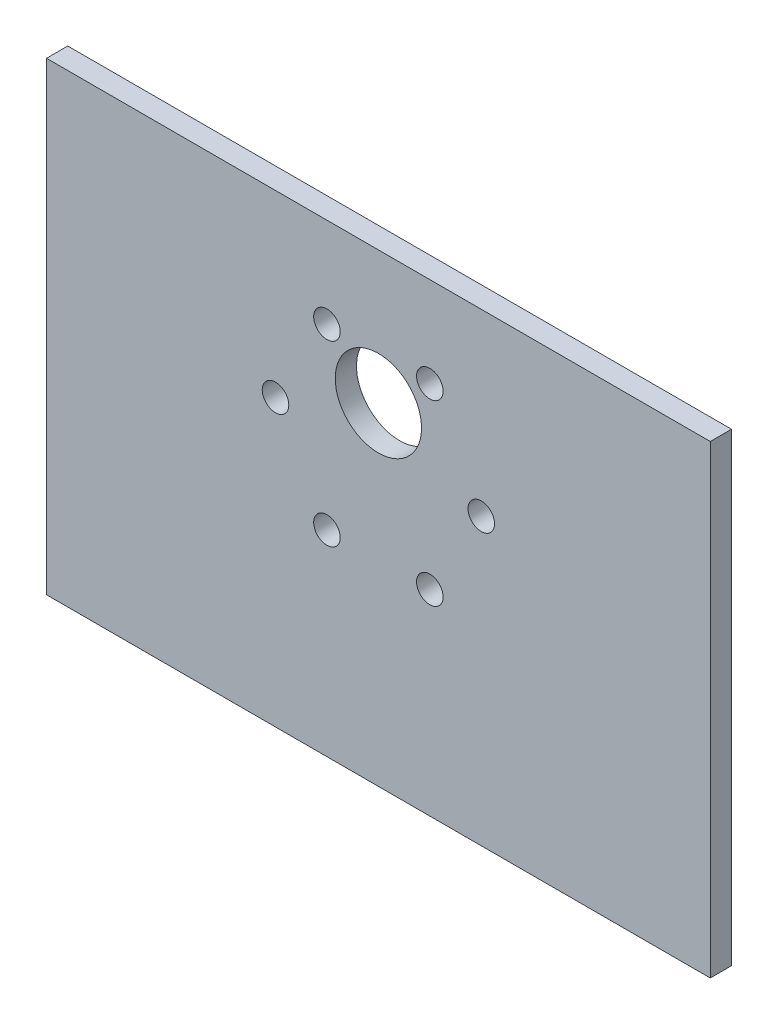
ISO-10303-21;
HEADER;
FILE_DESCRIPTION(('STEP AP214'),'2;1');
FILE_NAME('part.step','',(''),(''),'','','');
FILE_SCHEMA(('AUTOMOTIVE_DESIGN { 1 0 10303 214 1 1 1 1 }'));
ENDSEC;
DATA;
#1=APPLICATION_CONTEXT('core data for automotive mechanical design processes');
#2=APPLICATION_PROTOCOL_DEFINITION('international standard','automotive_design',2000,#1);
#3=PRODUCT_CONTEXT('',#1,'mechanical');
#4=PRODUCT('Part','Part','',(#3));
#5=PRODUCT_RELATED_PRODUCT_CATEGORY('part','',(#4));
#6=PRODUCT_DEFINITION_FORMATION('','',#4);
#7=PRODUCT_DEFINITION_CONTEXT('part definition',#1,'design');
#8=PRODUCT_DEFINITION('design','',#6,#7);
#9=PRODUCT_DEFINITION_SHAPE('','',#8);
#10=(LENGTH_UNIT() NAMED_UNIT(*) SI_UNIT(.MILLI.,.METRE.));
#11=(NAMED_UNIT(*) PLANE_ANGLE_UNIT() SI_UNIT($,.RADIAN.));
#12=(NAMED_UNIT(*) SI_UNIT($,.STERADIAN.) SOLID_ANGLE_UNIT());
#13=UNCERTAINTY_MEASURE_WITH_UNIT(LENGTH_MEASURE(1.E-05),#10,'distance_accuracy_value','');
#14=(GEOMETRIC_REPRESENTATION_CONTEXT(3) GLOBAL_UNCERTAINTY_ASSIGNED_CONTEXT((#13)) GLOBAL_UNIT_ASSIGNED_CONTEXT((#10,
#11,#12)) REPRESENTATION_CONTEXT('',''));
#15=CARTESIAN_POINT('',(0.,0.,0.));
#16=DIRECTION('',(0.,0.,1.));
#17=DIRECTION('',(1.,0.,0.));
#18=AXIS2_PLACEMENT_3D('',#15,#16,#17);
#19=CARTESIAN_POINT('',(0.,0.,3.2));
#20=DIRECTION('',(0.,0.,1.));
#21=DIRECTION('',(1.,0.,0.));
#22=AXIS2_PLACEMENT_3D('',#19,#20,#21);
#23=PLANE('',#22);
#24=CARTESIAN_POINT('',(7.75000000000024,13.4233937586586,3.2));
#25=DIRECTION('',(0.,0.,1.));
#26=DIRECTION('',(1.,0.,0.));
#27=AXIS2_PLACEMENT_3D('',#24,#25,#26);
#28=CIRCLE('',#27,2.);
#29=CARTESIAN_POINT('',(9.75000000000024,13.4233937586586,3.2));
#30=VERTEX_POINT('',#29);
#31=EDGE_CURVE('E147',#30,#30,#28,.T.);
#32=ORIENTED_EDGE('',*,*,#31,.F.);
#33=EDGE_LOOP('',(#32));
#34=FACE_BOUND('',#33,.T.);
#35=CARTESIAN_POINT('',(-15.5,2.17707796235089E-13,3.2));
#36=DIRECTION('',(0.,0.,1.));
#37=DIRECTION('',(1.,0.,0.));
#38=AXIS2_PLACEMENT_3D('',#35,#36,#37);
#39=CIRCLE('',#38,2.);
#40=CARTESIAN_POINT('',(-13.5,2.17707796235089E-13,3.2));
#41=VERTEX_POINT('',#40);
#42=EDGE_CURVE('E135',#41,#41,#39,.T.);
#43=ORIENTED_EDGE('',*,*,#42,.F.);
#44=EDGE_LOOP('',(#43));
#45=FACE_BOUND('',#44,.T.);
#46=CARTESIAN_POINT('',(0.,6.99999999999996,3.2));
#47=DIRECTION('',(0.,0.,1.));
#48=DIRECTION('',(1.,0.,0.));
#49=AXIS2_PLACEMENT_3D('',#46,#47,#48);
#50=CIRCLE('',#49,6.5);
#51=CARTESIAN_POINT('',(6.5,6.99999999999996,3.2));
#52=VERTEX_POINT('',#51);
#53=EDGE_CURVE('E123',#52,#52,#50,.T.);
#54=ORIENTED_EDGE('',*,*,#53,.F.);
#55=EDGE_LOOP('',(#54));
#56=FACE_BOUND('',#55,.T.);
#57=DIRECTION('',(0.,-1.,0.));
#58=VECTOR('',#57,1.);
#59=CARTESIAN_POINT('',(-50.,27.,3.2));
#60=LINE('',#59,#58);
#61=CARTESIAN_POINT('',(-50.,27.,3.2));
#62=VERTEX_POINT('',#61);
#63=CARTESIAN_POINT('',(-50.,-43.,3.2));
#64=VERTEX_POINT('',#63);
#65=EDGE_CURVE('E93',#62,#64,#60,.T.);
#66=ORIENTED_EDGE('',*,*,#65,.T.);
#67=DIRECTION('',(1.,0.,0.));
#68=VECTOR('',#67,1.);
#69=CARTESIAN_POINT('',(-50.,-43.,3.2));
#70=LINE('',#69,#68);
#71=CARTESIAN_POINT('',(50.,-43.,3.2));
#72=VERTEX_POINT('',#71);
#73=EDGE_CURVE('E88',#64,#72,#70,.T.);
#74=ORIENTED_EDGE('',*,*,#73,.T.);
#75=DIRECTION('',(0.,1.,0.));
#76=VECTOR('',#75,1.);
#77=CARTESIAN_POINT('',(50.,27.,3.2));
#78=LINE('',#77,#76);
#79=CARTESIAN_POINT('',(50.,27.,3.2));
#80=VERTEX_POINT('',#79);
#81=EDGE_CURVE('E91',#72,#80,#78,.T.);
#82=ORIENTED_EDGE('',*,*,#81,.T.);
#83=DIRECTION('',(-1.,0.,0.));
#84=VECTOR('',#83,1.);
#85=CARTESIAN_POINT('',(-50.,27.,3.2));
#86=LINE('',#85,#84);
#87=EDGE_CURVE('E58',#80,#62,#86,.T.);
#88=ORIENTED_EDGE('',*,*,#87,.T.);
#89=EDGE_LOOP('',(#66,#74,#82,#88));
#90=FACE_BOUND('',#89,.T.);
#91=CARTESIAN_POINT('',(7.74999999999987,-13.4233937586589,3.2));
#92=DIRECTION('',(0.,0.,1.));
#93=DIRECTION('',(1.,0.,0.));
#94=AXIS2_PLACEMENT_3D('',#91,#92,#93);
#95=CIRCLE('',#94,2.);
#96=CARTESIAN_POINT('',(9.74999999999987,-13.4233937586589,3.2));
#97=VERTEX_POINT('',#96);
#98=EDGE_CURVE('E108',#97,#97,#95,.T.);
#99=ORIENTED_EDGE('',*,*,#98,.F.);
#100=EDGE_LOOP('',(#99));
#101=FACE_BOUND('',#100,.T.);
#102=CARTESIAN_POINT('',(-7.75000000000015,-13.4233937586587,3.2));
#103=DIRECTION('',(0.,0.,1.));
#104=DIRECTION('',(1.,0.,0.));
#105=AXIS2_PLACEMENT_3D('',#102,#103,#104);
#106=CIRCLE('',#105,2.);
#107=CARTESIAN_POINT('',(-5.75000000000015,-13.4233937586587,3.2));
#108=VERTEX_POINT('',#107);
#109=EDGE_CURVE('E129',#108,#108,#106,.T.);
#110=ORIENTED_EDGE('',*,*,#109,.F.);
#111=EDGE_LOOP('',(#110));
#112=FACE_BOUND('',#111,.T.);
#113=CARTESIAN_POINT('',(-7.74999999999978,13.4233937586589,3.2));
#114=DIRECTION('',(0.,0.,1.));
#115=DIRECTION('',(1.,0.,0.));
#116=AXIS2_PLACEMENT_3D('',#113,#114,#115);
#117=CIRCLE('',#116,2.);
#118=CARTESIAN_POINT('',(-5.74999999999978,13.4233937586589,3.2));
#119=VERTEX_POINT('',#118);
#120=EDGE_CURVE('E141',#119,#119,#117,.T.);
#121=ORIENTED_EDGE('',*,*,#120,.F.);
#122=EDGE_LOOP('',(#121));
#123=FACE_BOUND('',#122,.T.);
#124=CARTESIAN_POINT('',(15.5,-3.21791204793698E-13,3.2));
#125=DIRECTION('',(0.,0.,1.));
#126=DIRECTION('',(1.,0.,0.));
#127=AXIS2_PLACEMENT_3D('',#124,#125,#126);
#128=CIRCLE('',#127,2.);
#129=CARTESIAN_POINT('',(17.5,-3.21791204793698E-13,3.2));
#130=VERTEX_POINT('',#129);
#131=EDGE_CURVE('E153',#130,#130,#128,.T.);
#132=ORIENTED_EDGE('',*,*,#131,.F.);
#133=EDGE_LOOP('',(#132));
#134=FACE_BOUND('',#133,.T.);
#135=ADVANCED_FACE('F41',(#34,#45,#56,#90,#101,#112,#123,#134),#23,.T.);
#136=CARTESIAN_POINT('',(0.,0.,0.));
#137=DIRECTION('',(0.,0.,1.));
#138=DIRECTION('',(1.,0.,0.));
#139=AXIS2_PLACEMENT_3D('',#136,#137,#138);
#140=PLANE('',#139);
#141=DIRECTION('',(0.,-1.,0.));
#142=VECTOR('',#141,1.);
#143=CARTESIAN_POINT('',(-50.,27.,0.));
#144=LINE('',#143,#142);
#145=CARTESIAN_POINT('',(-50.,27.,0.));
#146=VERTEX_POINT('',#145);
#147=CARTESIAN_POINT('',(-50.,-43.,0.));
#148=VERTEX_POINT('',#147);
#149=EDGE_CURVE('E105',#146,#148,#144,.T.);
#150=ORIENTED_EDGE('',*,*,#149,.F.);
#151=DIRECTION('',(-1.,0.,0.));
#152=VECTOR('',#151,1.);
#153=CARTESIAN_POINT('',(-50.,27.,0.));
#154=LINE('',#153,#152);
#155=CARTESIAN_POINT('',(50.,27.,0.));
#156=VERTEX_POINT('',#155);
#157=EDGE_CURVE('E81',#156,#146,#154,.T.);
#158=ORIENTED_EDGE('',*,*,#157,.F.);
#159=DIRECTION('',(0.,1.,0.));
#160=VECTOR('',#159,1.);
#161=CARTESIAN_POINT('',(50.,27.,0.));
#162=LINE('',#161,#160);
#163=CARTESIAN_POINT('',(50.,-43.,0.));
#164=VERTEX_POINT('',#163);
#165=EDGE_CURVE('E75',#164,#156,#162,.T.);
#166=ORIENTED_EDGE('',*,*,#165,.F.);
#167=DIRECTION('',(1.,0.,0.));
#168=VECTOR('',#167,1.);
#169=CARTESIAN_POINT('',(-50.,-43.,0.));
#170=LINE('',#169,#168);
#171=EDGE_CURVE('E97',#148,#164,#170,.T.);
#172=ORIENTED_EDGE('',*,*,#171,.F.);
#173=EDGE_LOOP('',(#150,#158,#166,#172));
#174=FACE_BOUND('',#173,.T.);
#175=CARTESIAN_POINT('',(7.74999999999987,-13.4233937586589,0.));
#176=DIRECTION('',(0.,0.,1.));
#177=DIRECTION('',(1.,0.,0.));
#178=AXIS2_PLACEMENT_3D('',#175,#176,#177);
#179=CIRCLE('',#178,2.);
#180=CARTESIAN_POINT('',(9.74999999999987,-13.4233937586589,0.));
#181=VERTEX_POINT('',#180);
#182=EDGE_CURVE('E120',#181,#181,#179,.T.);
#183=ORIENTED_EDGE('',*,*,#182,.T.);
#184=EDGE_LOOP('',(#183));
#185=FACE_BOUND('',#184,.T.);
#186=CARTESIAN_POINT('',(0.,6.99999999999996,0.));
#187=DIRECTION('',(0.,0.,1.));
#188=DIRECTION('',(1.,0.,0.));
#189=AXIS2_PLACEMENT_3D('',#186,#187,#188);
#190=CIRCLE('',#189,6.5);
#191=CARTESIAN_POINT('',(6.5,6.99999999999996,0.));
#192=VERTEX_POINT('',#191);
#193=EDGE_CURVE('E126',#192,#192,#190,.T.);
#194=ORIENTED_EDGE('',*,*,#193,.T.);
#195=EDGE_LOOP('',(#194));
#196=FACE_BOUND('',#195,.T.);
#197=CARTESIAN_POINT('',(-7.75000000000015,-13.4233937586587,0.));
#198=DIRECTION('',(0.,0.,1.));
#199=DIRECTION('',(1.,0.,0.));
#200=AXIS2_PLACEMENT_3D('',#197,#198,#199);
#201=CIRCLE('',#200,2.);
#202=CARTESIAN_POINT('',(-5.75000000000015,-13.4233937586587,0.));
#203=VERTEX_POINT('',#202);
#204=EDGE_CURVE('E132',#203,#203,#201,.T.);
#205=ORIENTED_EDGE('',*,*,#204,.T.);
#206=EDGE_LOOP('',(#205));
#207=FACE_BOUND('',#206,.T.);
#208=CARTESIAN_POINT('',(-15.5,2.17707796235089E-13,0.));
#209=DIRECTION('',(0.,0.,1.));
#210=DIRECTION('',(1.,0.,0.));
#211=AXIS2_PLACEMENT_3D('',#208,#209,#210);
#212=CIRCLE('',#211,2.);
#213=CARTESIAN_POINT('',(-13.5,2.17707796235089E-13,0.));
#214=VERTEX_POINT('',#213);
#215=EDGE_CURVE('E138',#214,#214,#212,.T.);
#216=ORIENTED_EDGE('',*,*,#215,.T.);
#217=EDGE_LOOP('',(#216));
#218=FACE_BOUND('',#217,.T.);
#219=CARTESIAN_POINT('',(-7.74999999999978,13.4233937586589,0.));
#220=DIRECTION('',(0.,0.,1.));
#221=DIRECTION('',(1.,0.,0.));
#222=AXIS2_PLACEMENT_3D('',#219,#220,#221);
#223=CIRCLE('',#222,2.);
#224=CARTESIAN_POINT('',(-5.74999999999978,13.4233937586589,0.));
#225=VERTEX_POINT('',#224);
#226=EDGE_CURVE('E144',#225,#225,#223,.T.);
#227=ORIENTED_EDGE('',*,*,#226,.T.);
#228=EDGE_LOOP('',(#227));
#229=FACE_BOUND('',#228,.T.);
#230=CARTESIAN_POINT('',(7.75000000000024,13.4233937586586,0.));
#231=DIRECTION('',(0.,0.,1.));
#232=DIRECTION('',(1.,0.,0.));
#233=AXIS2_PLACEMENT_3D('',#230,#231,#232);
#234=CIRCLE('',#233,2.);
#235=CARTESIAN_POINT('',(9.75000000000024,13.4233937586586,0.));
#236=VERTEX_POINT('',#235);
#237=EDGE_CURVE('E150',#236,#236,#234,.T.);
#238=ORIENTED_EDGE('',*,*,#237,.T.);
#239=EDGE_LOOP('',(#238));
#240=FACE_BOUND('',#239,.T.);
#241=CARTESIAN_POINT('',(15.5,-3.21791204793698E-13,0.));
#242=DIRECTION('',(0.,0.,1.));
#243=DIRECTION('',(1.,0.,0.));
#244=AXIS2_PLACEMENT_3D('',#241,#242,#243);
#245=CIRCLE('',#244,2.);
#246=CARTESIAN_POINT('',(17.5,-3.21791204793698E-13,0.));
#247=VERTEX_POINT('',#246);
#248=EDGE_CURVE('E156',#247,#247,#245,.T.);
#249=ORIENTED_EDGE('',*,*,#248,.T.);
#250=EDGE_LOOP('',(#249));
#251=FACE_BOUND('',#250,.T.);
#252=ADVANCED_FACE('F116',(#174,#185,#196,#207,#218,#229,#240,#251),#140,.F.);
#253=CARTESIAN_POINT('',(-50.,27.,3.2));
#254=DIRECTION('',(1.,0.,0.));
#255=DIRECTION('',(0.,1.,0.));
#256=AXIS2_PLACEMENT_3D('',#253,#254,#255);
#257=PLANE('',#256);
#258=ORIENTED_EDGE('',*,*,#149,.T.);
#259=DIRECTION('',(0.,0.,-1.));
#260=VECTOR('',#259,1.);
#261=CARTESIAN_POINT('',(-50.,-43.,3.2));
#262=LINE('',#261,#260);
#263=EDGE_CURVE('E11',#64,#148,#262,.T.);
#264=ORIENTED_EDGE('',*,*,#263,.F.);
#265=ORIENTED_EDGE('',*,*,#65,.F.);
#266=DIRECTION('',(0.,0.,-1.));
#267=VECTOR('',#266,1.);
#268=CARTESIAN_POINT('',(-50.,27.,3.2));
#269=LINE('',#268,#267);
#270=EDGE_CURVE('E101',#62,#146,#269,.T.);
#271=ORIENTED_EDGE('',*,*,#270,.T.);
#272=EDGE_LOOP('',(#258,#264,#265,#271));
#273=FACE_BOUND('',#272,.T.);
#274=ADVANCED_FACE('F43',(#273),#257,.F.);
#275=CARTESIAN_POINT('',(-50.,-43.,3.2));
#276=DIRECTION('',(0.,1.,0.));
#277=DIRECTION('',(0.,0.,1.));
#278=AXIS2_PLACEMENT_3D('',#275,#276,#277);
#279=PLANE('',#278);
#280=ORIENTED_EDGE('',*,*,#171,.T.);
#281=DIRECTION('',(0.,0.,-1.));
#282=VECTOR('',#281,1.);
#283=CARTESIAN_POINT('',(50.,-43.,3.2));
#284=LINE('',#283,#282);
#285=EDGE_CURVE('E50',#72,#164,#284,.T.);
#286=ORIENTED_EDGE('',*,*,#285,.F.);
#287=ORIENTED_EDGE('',*,*,#73,.F.);
#288=ORIENTED_EDGE('',*,*,#263,.T.);
#289=EDGE_LOOP('',(#280,#286,#287,#288));
#290=FACE_BOUND('',#289,.T.);
#291=ADVANCED_FACE('F96',(#290),#279,.F.);
#292=CARTESIAN_POINT('',(50.,27.,3.2));
#293=DIRECTION('',(-1.,0.,0.));
#294=DIRECTION('',(0.,-1.,0.));
#295=AXIS2_PLACEMENT_3D('',#292,#293,#294);
#296=PLANE('',#295);
#297=ORIENTED_EDGE('',*,*,#165,.T.);
#298=DIRECTION('',(0.,0.,-1.));
#299=VECTOR('',#298,1.);
#300=CARTESIAN_POINT('',(50.,27.,3.2));
#301=LINE('',#300,#299);
#302=EDGE_CURVE('E98',#80,#156,#301,.T.);
#303=ORIENTED_EDGE('',*,*,#302,.F.);
#304=ORIENTED_EDGE('',*,*,#81,.F.);
#305=ORIENTED_EDGE('',*,*,#285,.T.);
#306=EDGE_LOOP('',(#297,#303,#304,#305));
#307=FACE_BOUND('',#306,.T.);
#308=ADVANCED_FACE('F99',(#307),#296,.F.);
#309=CARTESIAN_POINT('',(-50.,27.,3.2));
#310=DIRECTION('',(0.,-1.,0.));
#311=DIRECTION('',(1.,0.,0.));
#312=AXIS2_PLACEMENT_3D('',#309,#310,#311);
#313=PLANE('',#312);
#314=ORIENTED_EDGE('',*,*,#157,.T.);
#315=ORIENTED_EDGE('',*,*,#270,.F.);
#316=ORIENTED_EDGE('',*,*,#87,.F.);
#317=ORIENTED_EDGE('',*,*,#302,.T.);
#318=EDGE_LOOP('',(#314,#315,#316,#317));
#319=FACE_BOUND('',#318,.T.);
#320=ADVANCED_FACE('F113',(#319),#313,.F.);
#321=CARTESIAN_POINT('',(7.74999999999987,-13.4233937586589,3.2));
#322=DIRECTION('',(0.,0.,-1.));
#323=DIRECTION('',(-1.,0.,0.));
#324=AXIS2_PLACEMENT_3D('',#321,#322,#323);
#325=CYLINDRICAL_SURFACE('',#324,2.);
#326=ORIENTED_EDGE('',*,*,#98,.T.);
#327=EDGE_LOOP('',(#326));
#328=FACE_BOUND('',#327,.T.);
#329=ORIENTED_EDGE('',*,*,#182,.F.);
#330=EDGE_LOOP('',(#329));
#331=FACE_BOUND('',#330,.T.);
#332=ADVANCED_FACE('F175',(#328,#331),#325,.F.);
#333=CARTESIAN_POINT('',(0.,6.99999999999996,3.2));
#334=DIRECTION('',(0.,0.,-1.));
#335=DIRECTION('',(-1.,0.,0.));
#336=AXIS2_PLACEMENT_3D('',#333,#334,#335);
#337=CYLINDRICAL_SURFACE('',#336,6.5);
#338=ORIENTED_EDGE('',*,*,#53,.T.);
#339=EDGE_LOOP('',(#338));
#340=FACE_BOUND('',#339,.T.);
#341=ORIENTED_EDGE('',*,*,#193,.F.);
#342=EDGE_LOOP('',(#341));
#343=FACE_BOUND('',#342,.T.);
#344=ADVANCED_FACE('F229',(#340,#343),#337,.F.);
#345=CARTESIAN_POINT('',(-7.75000000000015,-13.4233937586587,3.2));
#346=DIRECTION('',(0.,0.,-1.));
#347=DIRECTION('',(-1.,0.,0.));
#348=AXIS2_PLACEMENT_3D('',#345,#346,#347);
#349=CYLINDRICAL_SURFACE('',#348,2.);
#350=ORIENTED_EDGE('',*,*,#109,.T.);
#351=EDGE_LOOP('',(#350));
#352=FACE_BOUND('',#351,.T.);
#353=ORIENTED_EDGE('',*,*,#204,.F.);
#354=EDGE_LOOP('',(#353));
#355=FACE_BOUND('',#354,.T.);
#356=ADVANCED_FACE('F238',(#352,#355),#349,.F.);
#357=CARTESIAN_POINT('',(-15.5,2.17707796235089E-13,3.2));
#358=DIRECTION('',(0.,0.,-1.));
#359=DIRECTION('',(-1.,0.,0.));
#360=AXIS2_PLACEMENT_3D('',#357,#358,#359);
#361=CYLINDRICAL_SURFACE('',#360,2.);
#362=ORIENTED_EDGE('',*,*,#42,.T.);
#363=EDGE_LOOP('',(#362));
#364=FACE_BOUND('',#363,.T.);
#365=ORIENTED_EDGE('',*,*,#215,.F.);
#366=EDGE_LOOP('',(#365));
#367=FACE_BOUND('',#366,.T.);
#368=ADVANCED_FACE('F247',(#364,#367),#361,.F.);
#369=CARTESIAN_POINT('',(-7.74999999999978,13.4233937586589,3.2));
#370=DIRECTION('',(0.,0.,-1.));
#371=DIRECTION('',(-1.,0.,0.));
#372=AXIS2_PLACEMENT_3D('',#369,#370,#371);
#373=CYLINDRICAL_SURFACE('',#372,2.);
#374=ORIENTED_EDGE('',*,*,#120,.T.);
#375=EDGE_LOOP('',(#374));
#376=FACE_BOUND('',#375,.T.);
#377=ORIENTED_EDGE('',*,*,#226,.F.);
#378=EDGE_LOOP('',(#377));
#379=FACE_BOUND('',#378,.T.);
#380=ADVANCED_FACE('F257',(#376,#379),#373,.F.);
#381=CARTESIAN_POINT('',(7.75000000000024,13.4233937586586,3.2));
#382=DIRECTION('',(0.,0.,-1.));
#383=DIRECTION('',(-1.,0.,0.));
#384=AXIS2_PLACEMENT_3D('',#381,#382,#383);
#385=CYLINDRICAL_SURFACE('',#384,2.);
#386=ORIENTED_EDGE('',*,*,#31,.T.);
#387=EDGE_LOOP('',(#386));
#388=FACE_BOUND('',#387,.T.);
#389=ORIENTED_EDGE('',*,*,#237,.F.);
#390=EDGE_LOOP('',(#389));
#391=FACE_BOUND('',#390,.T.);
#392=ADVANCED_FACE('F267',(#388,#391),#385,.F.);
#393=CARTESIAN_POINT('',(15.5,-3.21791204793698E-13,3.2));
#394=DIRECTION('',(0.,0.,-1.));
#395=DIRECTION('',(-1.,0.,0.));
#396=AXIS2_PLACEMENT_3D('',#393,#394,#395);
#397=CYLINDRICAL_SURFACE('',#396,2.);
#398=ORIENTED_EDGE('',*,*,#131,.T.);
#399=EDGE_LOOP('',(#398));
#400=FACE_BOUND('',#399,.T.);
#401=ORIENTED_EDGE('',*,*,#248,.F.);
#402=EDGE_LOOP('',(#401));
#403=FACE_BOUND('',#402,.T.);
#404=ADVANCED_FACE('F162',(#400,#403),#397,.F.);
#405=CLOSED_SHELL('',(#135,#252,#274,#291,#308,#320,#332,#344,#356,#368,#380,#392,#404));
#406=MANIFOLD_SOLID_BREP('B2',#405);
#407=ADVANCED_BREP_SHAPE_REPRESENTATION('',(#18,#406),#14);
#408=SHAPE_DEFINITION_REPRESENTATION(#9,#407);
ENDSEC;
END-ISO-10303-21;
